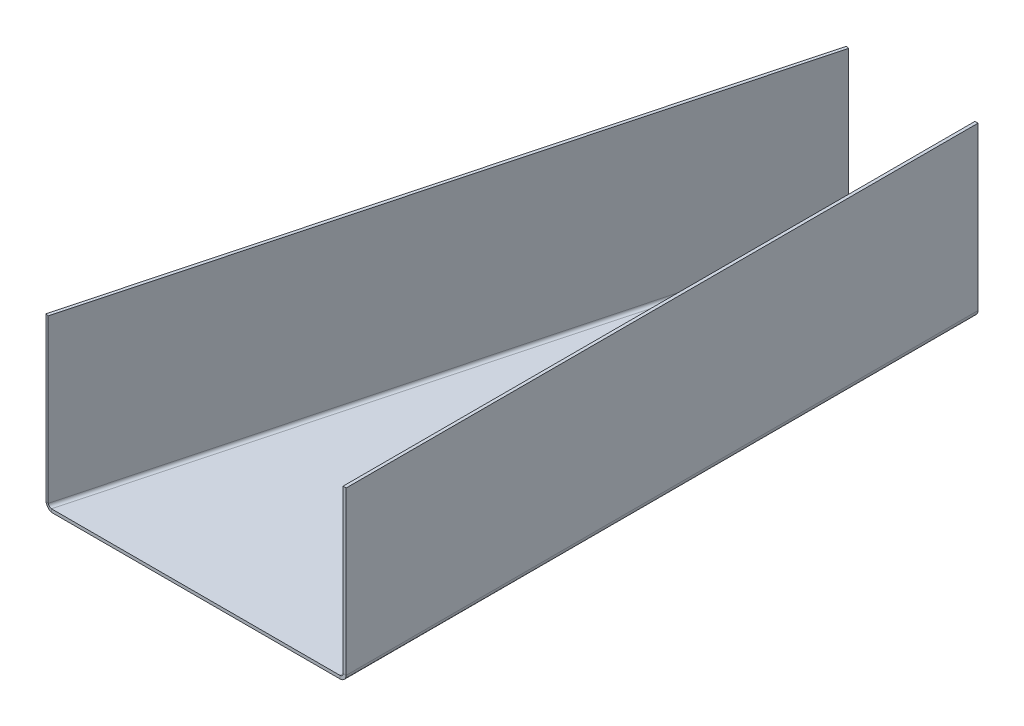
ISO-10303-21;
HEADER;
FILE_DESCRIPTION(('STEP AP214'),'2;1');
FILE_NAME('part.step','',(''),(''),'','','');
FILE_SCHEMA(('AUTOMOTIVE_DESIGN { 1 0 10303 214 1 1 1 1 }'));
ENDSEC;
DATA;
#1=APPLICATION_CONTEXT('core data for automotive mechanical design processes');
#2=APPLICATION_PROTOCOL_DEFINITION('international standard','automotive_design',2000,#1);
#3=PRODUCT_CONTEXT('',#1,'mechanical');
#4=PRODUCT('Part','Part','',(#3));
#5=PRODUCT_RELATED_PRODUCT_CATEGORY('part','',(#4));
#6=PRODUCT_DEFINITION_FORMATION('','',#4);
#7=PRODUCT_DEFINITION_CONTEXT('part definition',#1,'design');
#8=PRODUCT_DEFINITION('design','',#6,#7);
#9=PRODUCT_DEFINITION_SHAPE('','',#8);
#10=(LENGTH_UNIT() NAMED_UNIT(*) SI_UNIT(.MILLI.,.METRE.));
#11=(NAMED_UNIT(*) PLANE_ANGLE_UNIT() SI_UNIT($,.RADIAN.));
#12=(NAMED_UNIT(*) SI_UNIT($,.STERADIAN.) SOLID_ANGLE_UNIT());
#13=UNCERTAINTY_MEASURE_WITH_UNIT(LENGTH_MEASURE(1.E-05),#10,'distance_accuracy_value','');
#14=(GEOMETRIC_REPRESENTATION_CONTEXT(3) GLOBAL_UNCERTAINTY_ASSIGNED_CONTEXT((#13)) GLOBAL_UNIT_ASSIGNED_CONTEXT((#10,
#11,#12)) REPRESENTATION_CONTEXT('',''));
#15=CARTESIAN_POINT('',(0.,0.,0.));
#16=DIRECTION('',(0.,0.,1.));
#17=DIRECTION('',(1.,0.,0.));
#18=AXIS2_PLACEMENT_3D('',#15,#16,#17);
#19=CARTESIAN_POINT('',(5.22681161664081,-0.7366,-75.4860248928017));
#20=DIRECTION('',(0.,0.,-1.));
#21=DIRECTION('',(-1.,0.,0.));
#22=AXIS2_PLACEMENT_3D('',#19,#20,#21);
#23=PLANE('',#22);
#24=DIRECTION('',(-1.,0.,0.));
#25=VECTOR('',#24,1.);
#26=CARTESIAN_POINT('',(5.22681161664081,-0.7366,-75.4860248928017));
#27=LINE('',#26,#25);
#28=CARTESIAN_POINT('',(34.4902116166408,-0.736599999999994,-75.4860248928017));
#29=VERTEX_POINT('',#28);
#30=CARTESIAN_POINT('',(6.37032232476729,-0.7366,-75.4860248928017));
#31=VERTEX_POINT('',#30);
#32=EDGE_CURVE('E45',#29,#31,#27,.T.);
#33=ORIENTED_EDGE('',*,*,#32,.T.);
#34=DIRECTION('',(0.,1.,0.));
#35=VECTOR('',#34,1.);
#36=CARTESIAN_POINT('',(6.37032232476729,-0.7366,-75.4860248928017));
#37=LINE('',#36,#35);
#38=CARTESIAN_POINT('',(6.37032232476729,0.,-75.4860248928017));
#39=VERTEX_POINT('',#38);
#40=EDGE_CURVE('E183',#31,#39,#37,.T.);
#41=ORIENTED_EDGE('',*,*,#40,.T.);
#42=DIRECTION('',(-1.,0.,0.));
#43=VECTOR('',#42,1.);
#44=CARTESIAN_POINT('',(5.22681161664081,0.,-75.4860248928017));
#45=LINE('',#44,#43);
#46=CARTESIAN_POINT('',(34.4902116166408,0.,-75.4860248928017));
#47=VERTEX_POINT('',#46);
#48=EDGE_CURVE('E145',#47,#39,#45,.T.);
#49=ORIENTED_EDGE('',*,*,#48,.F.);
#50=DIRECTION('',(0.,-1.,0.));
#51=VECTOR('',#50,1.);
#52=CARTESIAN_POINT('',(34.4902116166408,0.,-75.4860248928017));
#53=LINE('',#52,#51);
#54=EDGE_CURVE('E102',#47,#29,#53,.T.);
#55=ORIENTED_EDGE('',*,*,#54,.T.);
#56=EDGE_LOOP('',(#33,#41,#49,#55));
#57=FACE_BOUND('',#56,.T.);
#58=ADVANCED_FACE('F37',(#57),#23,.T.);
#59=CARTESIAN_POINT('',(0.,-0.7366,0.));
#60=DIRECTION('',(0.,-1.,0.));
#61=DIRECTION('',(0.,0.,-1.));
#62=AXIS2_PLACEMENT_3D('',#59,#60,#61);
#63=PLANE('',#62);
#64=DIRECTION('',(1.,0.,0.));
#65=VECTOR('',#64,1.);
#66=CARTESIAN_POINT('',(-34.7731883833592,-0.7366,74.5139751071983));
#67=LINE('',#66,#65);
#68=CARTESIAN_POINT('',(-34.0108479112749,-0.736599999999982,74.5139751071983));
#69=VERTEX_POINT('',#68);
#70=CARTESIAN_POINT('',(34.4902116166408,-0.7366,74.5139751071983));
#71=VERTEX_POINT('',#70);
#72=EDGE_CURVE('E11',#69,#71,#67,.T.);
#73=ORIENTED_EDGE('',*,*,#72,.F.);
#74=DIRECTION('',(-0.257662650560332,0.,0.966234939601246));
#75=VECTOR('',#74,1.);
#76=CARTESIAN_POINT('',(-34.0614597268489,-0.736599999999982,74.703769415601));
#77=LINE('',#76,#75);
#78=CARTESIAN_POINT('',(5.93854027315106,-0.7366,-75.296230584399));
#79=VERTEX_POINT('',#78);
#80=EDGE_CURVE('E274',#69,#79,#77,.F.);
#81=ORIENTED_EDGE('',*,*,#80,.T.);
#82=DIRECTION('',(0.966234939601246,0.,0.257662650560332));
#83=VECTOR('',#82,1.);
#84=CARTESIAN_POINT('',(19.1402094582338,-0.7366,-71.7757854683769));
#85=LINE('',#84,#83);
#86=CARTESIAN_POINT('',(6.2944046014062,-0.7366,-75.2013334301976));
#87=VERTEX_POINT('',#86);
#88=EDGE_CURVE('E192',#79,#87,#85,.T.);
#89=ORIENTED_EDGE('',*,*,#88,.T.);
#90=DIRECTION('',(0.25766265056033,0.,-0.966234939601247));
#91=VECTOR('',#90,1.);
#92=CARTESIAN_POINT('',(-12.8458048568275,-0.7366,-3.42554796182063));
#93=LINE('',#92,#91);
#94=EDGE_CURVE('E188',#87,#31,#93,.T.);
#95=ORIENTED_EDGE('',*,*,#94,.T.);
#96=ORIENTED_EDGE('',*,*,#32,.F.);
#97=DIRECTION('',(0.,0.,-1.));
#98=VECTOR('',#97,1.);
#99=CARTESIAN_POINT('',(34.4902116166408,-0.736599999999994,-75.4860248928017));
#100=LINE('',#99,#98);
#101=EDGE_CURVE('E59',#29,#71,#100,.F.);
#102=ORIENTED_EDGE('',*,*,#101,.T.);
#103=EDGE_LOOP('',(#73,#81,#89,#95,#96,#102));
#104=FACE_BOUND('',#103,.T.);
#105=ADVANCED_FACE('F170',(#104),#63,.T.);
#106=CARTESIAN_POINT('',(0.,0.,0.));
#107=DIRECTION('',(0.,-1.,0.));
#108=DIRECTION('',(0.,0.,-1.));
#109=AXIS2_PLACEMENT_3D('',#106,#107,#108);
#110=PLANE('',#109);
#111=DIRECTION('',(-0.257662650560332,0.,0.966234939601246));
#112=VECTOR('',#111,1.);
#113=CARTESIAN_POINT('',(-34.0614597268489,0.,74.703769415601));
#114=LINE('',#113,#112);
#115=CARTESIAN_POINT('',(-34.0108479112749,0.,74.5139751071983));
#116=VERTEX_POINT('',#115);
#117=CARTESIAN_POINT('',(5.93854027315106,0.,-75.296230584399));
#118=VERTEX_POINT('',#117);
#119=EDGE_CURVE('E159',#116,#118,#114,.F.);
#120=ORIENTED_EDGE('',*,*,#119,.F.);
#121=DIRECTION('',(1.,0.,0.));
#122=VECTOR('',#121,1.);
#123=CARTESIAN_POINT('',(-34.7731883833592,0.,74.5139751071983));
#124=LINE('',#123,#122);
#125=CARTESIAN_POINT('',(34.4902116166408,0.,74.5139751071983));
#126=VERTEX_POINT('',#125);
#127=EDGE_CURVE('E40',#116,#126,#124,.T.);
#128=ORIENTED_EDGE('',*,*,#127,.T.);
#129=DIRECTION('',(0.,0.,-1.));
#130=VECTOR('',#129,1.);
#131=CARTESIAN_POINT('',(34.4902116166408,0.,-75.4860248928017));
#132=LINE('',#131,#130);
#133=EDGE_CURVE('E103',#47,#126,#132,.F.);
#134=ORIENTED_EDGE('',*,*,#133,.F.);
#135=ORIENTED_EDGE('',*,*,#48,.T.);
#136=DIRECTION('',(0.25766265056033,0.,-0.966234939601247));
#137=VECTOR('',#136,1.);
#138=CARTESIAN_POINT('',(6.2944046014062,0.,-75.2013334301976));
#139=LINE('',#138,#137);
#140=CARTESIAN_POINT('',(6.2944046014062,0.,-75.2013334301976));
#141=VERTEX_POINT('',#140);
#142=EDGE_CURVE('E200',#141,#39,#139,.T.);
#143=ORIENTED_EDGE('',*,*,#142,.F.);
#144=DIRECTION('',(0.966234939601246,0.,0.257662650560332));
#145=VECTOR('',#144,1.);
#146=CARTESIAN_POINT('',(5.93854027315106,0.,-75.296230584399));
#147=LINE('',#146,#145);
#148=EDGE_CURVE('E196',#118,#141,#147,.T.);
#149=ORIENTED_EDGE('',*,*,#148,.F.);
#150=EDGE_LOOP('',(#120,#128,#134,#135,#143,#149));
#151=FACE_BOUND('',#150,.T.);
#152=ADVANCED_FACE('F155',(#151),#110,.F.);
#153=CARTESIAN_POINT('',(-34.7731883833592,-0.7366,74.5139751071983));
#154=DIRECTION('',(0.,0.,1.));
#155=DIRECTION('',(1.,0.,0.));
#156=AXIS2_PLACEMENT_3D('',#153,#154,#155);
#157=PLANE('',#156);
#158=ORIENTED_EDGE('',*,*,#127,.F.);
#159=DIRECTION('',(0.,-1.,0.));
#160=VECTOR('',#159,1.);
#161=CARTESIAN_POINT('',(-34.0108479112749,0.,74.5139751071983));
#162=LINE('',#161,#160);
#163=EDGE_CURVE('E319',#116,#69,#162,.T.);
#164=ORIENTED_EDGE('',*,*,#163,.T.);
#165=ORIENTED_EDGE('',*,*,#72,.T.);
#166=DIRECTION('',(0.,-1.,0.));
#167=VECTOR('',#166,1.);
#168=CARTESIAN_POINT('',(34.4902116166408,0.,74.5139751071983));
#169=LINE('',#168,#167);
#170=EDGE_CURVE('E142',#126,#71,#169,.T.);
#171=ORIENTED_EDGE('',*,*,#170,.F.);
#172=EDGE_LOOP('',(#158,#164,#165,#171));
#173=FACE_BOUND('',#172,.T.);
#174=ADVANCED_FACE('F163',(#173),#157,.T.);
#175=CARTESIAN_POINT('',(34.4902116166408,0.736600000000003,74.5139751071983));
#176=DIRECTION('',(0.,0.,1.));
#177=DIRECTION('',(1.,0.,0.));
#178=AXIS2_PLACEMENT_3D('',#175,#176,#177);
#179=PLANE('',#178);
#180=DIRECTION('',(1.,0.,0.));
#181=VECTOR('',#180,1.);
#182=CARTESIAN_POINT('',(35.2268116166408,0.736599999999997,74.5139751071983));
#183=LINE('',#182,#181);
#184=CARTESIAN_POINT('',(35.2268116166408,0.7366,74.5139751071983));
#185=VERTEX_POINT('',#184);
#186=CARTESIAN_POINT('',(35.9634116166408,0.736599999999998,74.5139751071983));
#187=VERTEX_POINT('',#186);
#188=EDGE_CURVE('E93',#185,#187,#183,.T.);
#189=ORIENTED_EDGE('',*,*,#188,.F.);
#190=CARTESIAN_POINT('',(34.4902116166408,0.736600000000003,74.5139751071983));
#191=DIRECTION('',(0.,0.,-1.));
#192=DIRECTION('',(-1.,0.,0.));
#193=AXIS2_PLACEMENT_3D('',#190,#191,#192);
#194=CIRCLE('',#193,0.736599999999997);
#195=EDGE_CURVE('E87',#126,#185,#194,.F.);
#196=ORIENTED_EDGE('',*,*,#195,.F.);
#197=ORIENTED_EDGE('',*,*,#170,.T.);
#198=CARTESIAN_POINT('',(34.4902116166408,0.736600000000003,74.5139751071983));
#199=DIRECTION('',(0.,0.,-1.));
#200=DIRECTION('',(-1.,0.,0.));
#201=AXIS2_PLACEMENT_3D('',#198,#199,#200);
#202=CIRCLE('',#201,1.4732);
#203=EDGE_CURVE('E135',#71,#187,#202,.F.);
#204=ORIENTED_EDGE('',*,*,#203,.T.);
#205=EDGE_LOOP('',(#189,#196,#197,#204));
#206=FACE_BOUND('',#205,.T.);
#207=ADVANCED_FACE('F161',(#206),#179,.T.);
#208=CARTESIAN_POINT('',(34.4902116166408,0.736600000000003,-75.4860248928017));
#209=DIRECTION('',(0.,0.,1.));
#210=DIRECTION('',(1.,0.,0.));
#211=AXIS2_PLACEMENT_3D('',#208,#209,#210);
#212=PLANE('',#211);
#213=CARTESIAN_POINT('',(34.4902116166408,0.736600000000003,-75.4860248928017));
#214=DIRECTION('',(0.,0.,-1.));
#215=DIRECTION('',(-1.,0.,0.));
#216=AXIS2_PLACEMENT_3D('',#213,#214,#215);
#217=CIRCLE('',#216,0.736599999999997);
#218=CARTESIAN_POINT('',(35.2268116166408,0.7366,-75.4860248928017));
#219=VERTEX_POINT('',#218);
#220=EDGE_CURVE('E84',#219,#47,#217,.T.);
#221=ORIENTED_EDGE('',*,*,#220,.F.);
#222=DIRECTION('',(1.,0.,0.));
#223=VECTOR('',#222,1.);
#224=CARTESIAN_POINT('',(35.2268116166408,0.736600000000004,-75.4860248928017));
#225=LINE('',#224,#223);
#226=CARTESIAN_POINT('',(35.9634116166408,0.736600000000001,-75.4860248928017));
#227=VERTEX_POINT('',#226);
#228=EDGE_CURVE('E92',#219,#227,#225,.T.);
#229=ORIENTED_EDGE('',*,*,#228,.T.);
#230=CARTESIAN_POINT('',(34.4902116166408,0.736600000000003,-75.4860248928017));
#231=DIRECTION('',(0.,0.,-1.));
#232=DIRECTION('',(-1.,0.,0.));
#233=AXIS2_PLACEMENT_3D('',#230,#231,#232);
#234=CIRCLE('',#233,1.4732);
#235=EDGE_CURVE('E136',#227,#29,#234,.T.);
#236=ORIENTED_EDGE('',*,*,#235,.T.);
#237=ORIENTED_EDGE('',*,*,#54,.F.);
#238=EDGE_LOOP('',(#221,#229,#236,#237));
#239=FACE_BOUND('',#238,.T.);
#240=ADVANCED_FACE('F98',(#239),#212,.F.);
#241=CARTESIAN_POINT('',(34.4902116166408,0.736600000000003,-75.4860248928017));
#242=DIRECTION('',(0.,0.,-1.));
#243=DIRECTION('',(1.,0.,0.));
#244=AXIS2_PLACEMENT_3D('',#241,#242,#243);
#245=CYLINDRICAL_SURFACE('',#244,1.4732);
#246=ORIENTED_EDGE('',*,*,#101,.F.);
#247=ORIENTED_EDGE('',*,*,#235,.F.);
#248=DIRECTION('',(0.,0.,1.));
#249=VECTOR('',#248,1.);
#250=CARTESIAN_POINT('',(35.9634116166408,0.736599999999998,0.));
#251=LINE('',#250,#249);
#252=EDGE_CURVE('E116',#227,#187,#251,.T.);
#253=ORIENTED_EDGE('',*,*,#252,.T.);
#254=ORIENTED_EDGE('',*,*,#203,.F.);
#255=EDGE_LOOP('',(#246,#247,#253,#254));
#256=FACE_BOUND('',#255,.T.);
#257=ADVANCED_FACE('F370',(#256),#245,.T.);
#258=CARTESIAN_POINT('',(34.4902116166408,0.736600000000003,-75.4860248928017));
#259=DIRECTION('',(0.,0.,-1.));
#260=DIRECTION('',(1.,0.,0.));
#261=AXIS2_PLACEMENT_3D('',#258,#259,#260);
#262=CYLINDRICAL_SURFACE('',#261,0.736599999999997);
#263=ORIENTED_EDGE('',*,*,#133,.T.);
#264=ORIENTED_EDGE('',*,*,#195,.T.);
#265=DIRECTION('',(0.,0.,-1.));
#266=VECTOR('',#265,1.);
#267=CARTESIAN_POINT('',(35.2268116166408,0.736599999999997,74.5139751071983));
#268=LINE('',#267,#266);
#269=EDGE_CURVE('E80',#185,#219,#268,.T.);
#270=ORIENTED_EDGE('',*,*,#269,.T.);
#271=ORIENTED_EDGE('',*,*,#220,.T.);
#272=EDGE_LOOP('',(#263,#264,#270,#271));
#273=FACE_BOUND('',#272,.T.);
#274=ADVANCED_FACE('F83',(#273),#262,.F.);
#275=CARTESIAN_POINT('',(35.9634116166408,0.,74.5139751071983));
#276=DIRECTION('',(0.,0.,-1.));
#277=DIRECTION('',(-1.,0.,0.));
#278=AXIS2_PLACEMENT_3D('',#275,#276,#277);
#279=PLANE('',#278);
#280=ORIENTED_EDGE('',*,*,#188,.T.);
#281=DIRECTION('',(0.,-1.,0.));
#282=VECTOR('',#281,1.);
#283=CARTESIAN_POINT('',(35.9634116166408,0.,74.5139751071983));
#284=LINE('',#283,#282);
#285=CARTESIAN_POINT('',(35.9634116166409,39.2634,74.5139751071983));
#286=VERTEX_POINT('',#285);
#287=EDGE_CURVE('E124',#286,#187,#284,.T.);
#288=ORIENTED_EDGE('',*,*,#287,.F.);
#289=DIRECTION('',(-1.,0.,0.));
#290=VECTOR('',#289,1.);
#291=CARTESIAN_POINT('',(35.9634116166409,39.2634,74.5139751071983));
#292=LINE('',#291,#290);
#293=CARTESIAN_POINT('',(35.226811616641,39.2634,74.5139751071983));
#294=VERTEX_POINT('',#293);
#295=EDGE_CURVE('E129',#286,#294,#292,.T.);
#296=ORIENTED_EDGE('',*,*,#295,.T.);
#297=DIRECTION('',(0.,-1.,0.));
#298=VECTOR('',#297,1.);
#299=CARTESIAN_POINT('',(35.2268116166408,0.,74.5139751071983));
#300=LINE('',#299,#298);
#301=EDGE_CURVE('E122',#294,#185,#300,.T.);
#302=ORIENTED_EDGE('',*,*,#301,.T.);
#303=EDGE_LOOP('',(#280,#288,#296,#302));
#304=FACE_BOUND('',#303,.T.);
#305=ADVANCED_FACE('F223',(#304),#279,.F.);
#306=CARTESIAN_POINT('',(35.9634116166409,39.2634,-75.4860248928017));
#307=DIRECTION('',(0.,0.,1.));
#308=DIRECTION('',(1.,0.,0.));
#309=AXIS2_PLACEMENT_3D('',#306,#307,#308);
#310=PLANE('',#309);
#311=ORIENTED_EDGE('',*,*,#228,.F.);
#312=DIRECTION('',(0.,1.,0.));
#313=VECTOR('',#312,1.);
#314=CARTESIAN_POINT('',(35.226811616641,39.2634,-75.4860248928017));
#315=LINE('',#314,#313);
#316=CARTESIAN_POINT('',(35.226811616641,39.2634,-75.4860248928017));
#317=VERTEX_POINT('',#316);
#318=EDGE_CURVE('E112',#219,#317,#315,.T.);
#319=ORIENTED_EDGE('',*,*,#318,.T.);
#320=DIRECTION('',(-1.,0.,0.));
#321=VECTOR('',#320,1.);
#322=CARTESIAN_POINT('',(35.9634116166409,39.2634,-75.4860248928017));
#323=LINE('',#322,#321);
#324=CARTESIAN_POINT('',(35.9634116166409,39.2634,-75.4860248928017));
#325=VERTEX_POINT('',#324);
#326=EDGE_CURVE('E104',#325,#317,#323,.T.);
#327=ORIENTED_EDGE('',*,*,#326,.F.);
#328=DIRECTION('',(0.,1.,0.));
#329=VECTOR('',#328,1.);
#330=CARTESIAN_POINT('',(35.9634116166409,39.2634,-75.4860248928017));
#331=LINE('',#330,#329);
#332=EDGE_CURVE('E115',#227,#325,#331,.T.);
#333=ORIENTED_EDGE('',*,*,#332,.F.);
#334=EDGE_LOOP('',(#311,#319,#327,#333));
#335=FACE_BOUND('',#334,.T.);
#336=ADVANCED_FACE('F109',(#335),#310,.F.);
#337=CARTESIAN_POINT('',(35.9634116166408,-1.27082238608349E-13,0.));
#338=DIRECTION('',(-1.,0.,0.));
#339=DIRECTION('',(0.,-1.,0.));
#340=AXIS2_PLACEMENT_3D('',#337,#338,#339);
#341=PLANE('',#340);
#342=ORIENTED_EDGE('',*,*,#252,.F.);
#343=ORIENTED_EDGE('',*,*,#332,.T.);
#344=DIRECTION('',(0.,0.,1.));
#345=VECTOR('',#344,1.);
#346=CARTESIAN_POINT('',(35.9634116166409,39.2634,74.5139751071983));
#347=LINE('',#346,#345);
#348=EDGE_CURVE('E132',#325,#286,#347,.T.);
#349=ORIENTED_EDGE('',*,*,#348,.T.);
#350=ORIENTED_EDGE('',*,*,#287,.T.);
#351=EDGE_LOOP('',(#342,#343,#349,#350));
#352=FACE_BOUND('',#351,.T.);
#353=ADVANCED_FACE('F215',(#352),#341,.F.);
#354=CARTESIAN_POINT('',(35.2268116166408,-1.24510413454157E-13,0.));
#355=DIRECTION('',(-1.,0.,0.));
#356=DIRECTION('',(0.,-1.,0.));
#357=AXIS2_PLACEMENT_3D('',#354,#355,#356);
#358=PLANE('',#357);
#359=ORIENTED_EDGE('',*,*,#318,.F.);
#360=ORIENTED_EDGE('',*,*,#269,.F.);
#361=ORIENTED_EDGE('',*,*,#301,.F.);
#362=DIRECTION('',(0.,0.,1.));
#363=VECTOR('',#362,1.);
#364=CARTESIAN_POINT('',(35.226811616641,39.2634,74.5139751071983));
#365=LINE('',#364,#363);
#366=EDGE_CURVE('E121',#317,#294,#365,.T.);
#367=ORIENTED_EDGE('',*,*,#366,.F.);
#368=EDGE_LOOP('',(#359,#360,#361,#367));
#369=FACE_BOUND('',#368,.T.);
#370=ADVANCED_FACE('F119',(#369),#358,.T.);
#371=CARTESIAN_POINT('',(35.9634116166409,39.2634,74.5139751071983));
#372=DIRECTION('',(0.,-1.,0.));
#373=DIRECTION('',(1.,0.,0.));
#374=AXIS2_PLACEMENT_3D('',#371,#372,#373);
#375=PLANE('',#374);
#376=ORIENTED_EDGE('',*,*,#366,.T.);
#377=ORIENTED_EDGE('',*,*,#295,.F.);
#378=ORIENTED_EDGE('',*,*,#348,.F.);
#379=ORIENTED_EDGE('',*,*,#326,.T.);
#380=EDGE_LOOP('',(#376,#377,#378,#379));
#381=FACE_BOUND('',#380,.T.);
#382=ADVANCED_FACE('F220',(#381),#375,.F.);
#383=CARTESIAN_POINT('',(5.93854027315106,0.,-75.296230584399));
#384=DIRECTION('',(0.257662650560332,0.,-0.966234939601246));
#385=DIRECTION('',(-0.966234939601246,0.,-0.257662650560332));
#386=AXIS2_PLACEMENT_3D('',#383,#384,#385);
#387=PLANE('',#386);
#388=ORIENTED_EDGE('',*,*,#88,.F.);
#389=DIRECTION('',(0.,-1.,0.));
#390=VECTOR('',#389,1.);
#391=CARTESIAN_POINT('',(5.93854027315106,0.,-75.296230584399));
#392=LINE('',#391,#390);
#393=EDGE_CURVE('E592',#118,#79,#392,.T.);
#394=ORIENTED_EDGE('',*,*,#393,.F.);
#395=ORIENTED_EDGE('',*,*,#148,.T.);
#396=DIRECTION('',(0.,-1.,0.));
#397=VECTOR('',#396,1.);
#398=CARTESIAN_POINT('',(6.2944046014062,0.,-75.2013334301976));
#399=LINE('',#398,#397);
#400=EDGE_CURVE('E203',#141,#87,#399,.T.);
#401=ORIENTED_EDGE('',*,*,#400,.T.);
#402=EDGE_LOOP('',(#388,#394,#395,#401));
#403=FACE_BOUND('',#402,.T.);
#404=ADVANCED_FACE('F356',(#403),#387,.T.);
#405=CARTESIAN_POINT('',(6.2944046014062,0.,-75.2013334301976));
#406=DIRECTION('',(-0.966234939601247,0.,-0.25766265056033));
#407=DIRECTION('',(-0.25766265056033,0.,0.966234939601247));
#408=AXIS2_PLACEMENT_3D('',#405,#406,#407);
#409=PLANE('',#408);
#410=ORIENTED_EDGE('',*,*,#40,.F.);
#411=ORIENTED_EDGE('',*,*,#94,.F.);
#412=ORIENTED_EDGE('',*,*,#400,.F.);
#413=ORIENTED_EDGE('',*,*,#142,.T.);
#414=EDGE_LOOP('',(#410,#411,#412,#413));
#415=FACE_BOUND('',#414,.T.);
#416=ADVANCED_FACE('F343',(#415),#409,.T.);
#417=CARTESIAN_POINT('',(5.93854027315107,0.736600000000001,-75.296230584399));
#418=DIRECTION('',(0.257662650560332,0.,-0.966234939601246));
#419=DIRECTION('',(-0.966234939601246,0.,-0.257662650560332));
#420=AXIS2_PLACEMENT_3D('',#417,#418,#419);
#421=PLANE('',#420);
#422=DIRECTION('',(-0.966234939601246,0.,-0.257662650560333));
#423=VECTOR('',#422,1.);
#424=CARTESIAN_POINT('',(5.22681161664081,0.736599999999999,-75.4860248928017));
#425=LINE('',#424,#423);
#426=CARTESIAN_POINT('',(5.22681161664081,0.736599999999999,-75.4860248928018));
#427=VERTEX_POINT('',#426);
#428=CARTESIAN_POINT('',(4.51508296013056,0.736599999999996,-75.6758192012046));
#429=VERTEX_POINT('',#428);
#430=EDGE_CURVE('E584',#427,#429,#425,.T.);
#431=ORIENTED_EDGE('',*,*,#430,.F.);
#432=CARTESIAN_POINT('',(5.93854027315107,0.736600000000001,-75.296230584399));
#433=DIRECTION('',(-0.257662650560332,0.,0.966234939601246));
#434=DIRECTION('',(0.966234939601246,0.,0.257662650560332));
#435=AXIS2_PLACEMENT_3D('',#432,#433,#434);
#436=CIRCLE('',#435,0.736599999999983);
#437=EDGE_CURVE('E276',#118,#427,#436,.F.);
#438=ORIENTED_EDGE('',*,*,#437,.F.);
#439=ORIENTED_EDGE('',*,*,#393,.T.);
#440=CARTESIAN_POINT('',(5.93854027315108,0.736600000000001,-75.296230584399));
#441=DIRECTION('',(-0.257662650560332,0.,0.966234939601246));
#442=DIRECTION('',(0.966234939601246,0.,0.257662650560332));
#443=AXIS2_PLACEMENT_3D('',#440,#441,#442);
#444=CIRCLE('',#443,1.47319999999998);
#445=EDGE_CURVE('E317',#79,#429,#444,.F.);
#446=ORIENTED_EDGE('',*,*,#445,.T.);
#447=EDGE_LOOP('',(#431,#438,#439,#446));
#448=FACE_BOUND('',#447,.T.);
#449=ADVANCED_FACE('F340',(#448),#421,.T.);
#450=CARTESIAN_POINT('',(-35.4920343264346,0.736599999999996,74.3222828557115));
#451=CARTESIAN_POINT('',(-35.4878159199868,0.542759667509925,74.3064638315324));
#452=CARTESIAN_POINT('',(-35.4463649961854,0.349064981845723,74.3005795450186));
#453=CARTESIAN_POINT('',(-35.2946057343009,-0.00904113929180752,74.3071668827619));
#454=CARTESIAN_POINT('',(-35.1843545432254,-0.173276979006366,74.3196263010023));
#455=CARTESIAN_POINT('',(-34.9110910956188,-0.447359538182086,74.3586147549381));
#456=CARTESIAN_POINT('',(-34.748183037654,-0.557098417860092,74.3851160043491));
#457=CARTESIAN_POINT('',(-34.3937330887302,-0.705430830004081,74.4457541919695));
#458=CARTESIAN_POINT('',(-34.2023616196785,-0.743965999999979,74.4798487175224));
#459=CARTESIAN_POINT('',(-34.0108479112749,-0.743965999999982,74.5139751071983));
#460=CARTESIAN_POINT('',(-35.4849170398695,0.736599999999996,74.3241807987955));
#461=CARTESIAN_POINT('',(-35.4806986335803,0.543724050881794,74.3083617752113));
#462=CARTESIAN_POINT('',(-35.4394329535389,0.350993016761914,74.3024280897244));
#463=CARTESIAN_POINT('',(-35.2883867461782,-0.0053314818823955,74.3088252795946));
#464=CARTESIAN_POINT('',(-35.1786630851515,-0.168750227867031,74.3211440231554));
#465=CARTESIAN_POINT('',(-34.9067171905051,-0.441469192220981,74.3597811296351));
#466=CARTESIAN_POINT('',(-34.7445986370511,-0.550662107323475,74.3860718445099));
#467=CARTESIAN_POINT('',(-34.3918701540294,-0.698256547267743,74.4462509745564));
#468=CARTESIAN_POINT('',(-34.2014297986108,-0.736599999999979,74.4800972025034));
#469=CARTESIAN_POINT('',(-34.0108479112749,-0.736599999999982,74.5139751071983));
#470=CARTESIAN_POINT('',(-34.7731883833592,0.736599999999999,74.5139751071982));
#471=CARTESIAN_POINT('',(-34.7689699929322,0.64016238806869,74.498156143097));
#472=CARTESIAN_POINT('',(-34.7462286888961,0.543796508380959,74.4872825602958));
#473=CARTESIAN_POINT('',(-34.6664879339179,0.365634259058806,74.474664962864));
#474=CARTESIAN_POINT('',(-34.6095172777556,0.283924886066491,74.472916238461));
#475=CARTESIAN_POINT('',(-34.4693266791346,0.147565403889518,74.4764185993339));
#476=CARTESIAN_POINT('',(-34.3861585767587,0.0929689463382723,74.4816558605879));
#477=CARTESIAN_POINT('',(-34.20557668395,0.0191717263661385,74.4959292332442));
#478=CARTESIAN_POINT('',(-34.1082476918416,0.,74.5049457005956));
#479=CARTESIAN_POINT('',(-34.0108479112749,0.,74.5139751071983));
#480=CARTESIAN_POINT('',(-34.7659999239284,0.736599999999999,74.5158920297131));
#481=CARTESIAN_POINT('',(-34.7617815336616,0.641136415274278,74.5000730662127));
#482=CARTESIAN_POINT('',(-34.7392273258232,0.545743823646312,74.4891495904485));
#483=CARTESIAN_POINT('',(-34.6602067559141,0.369381013042313,74.476339943665));
#484=CARTESIAN_POINT('',(-34.6037689051009,0.28849690471722,74.4744491378355));
#485=CARTESIAN_POINT('',(-34.4649090349697,0.153514653310234,74.4775966377779));
#486=CARTESIAN_POINT('',(-34.3825383321497,0.0994696199802559,74.4826212591503));
#487=CARTESIAN_POINT('',(-34.2036951199022,0.0264177519298407,74.496430983657));
#488=CARTESIAN_POINT('',(-34.1073065525632,0.00743966000001948,74.5051966704263));
#489=CARTESIAN_POINT('',(-34.0108479112749,0.00743966000001843,74.5139751071983));
#490=B_SPLINE_SURFACE_WITH_KNOTS('',1,3,((#450,#451,#452,#453,#454,#455,#456,#457,#458,#459),
(#460,#461,#462,#463,#464,#465,#466,#467,#468,#469),(#470,#471,#472,#473,#474,#475,#476,#477,
#478,#479),(#480,#481,#482,#483,#484,#485,#486,#487,#488,#489)),.UNSPECIFIED.,.F.,.F.,.F.,(2,1,
1,2),(4,2,2,2,4),(-0.01,0.,1.,1.0101),(0.,0.25,0.5,0.75,1.),.UNSPECIFIED.);
#491=CARTESIAN_POINT('',(-34.7731883833592,0.736599999999999,74.5139751071982));
#492=CARTESIAN_POINT('',(-34.77266142398,0.724547398513027,74.5119980172769));
#493=CARTESIAN_POINT('',(-34.7718481524947,0.712494818780692,74.5100972772505));
#494=CARTESIAN_POINT('',(-34.7696507590766,0.688418683400155,74.5064480239838));
#495=CARTESIAN_POINT('',(-34.7682666371438,0.676395127751953,74.5046995107434));
#496=CARTESIAN_POINT('',(-34.7649293165951,0.652406021114541,74.5013542380448));
#497=CARTESIAN_POINT('',(-34.7629761179792,0.640440470125331,74.4997574785866));
#498=CARTESIAN_POINT('',(-34.7585041572759,0.616596194907034,74.4967147765959));
#499=CARTESIAN_POINT('',(-34.7559853951885,0.604717470677948,74.4952688340634));
#500=CARTESIAN_POINT('',(-34.7503870845086,0.581075466927899,74.4925264920665));
#501=CARTESIAN_POINT('',(-34.7473075359162,0.569312187406937,74.491230092602));
#502=CARTESIAN_POINT('',(-34.740593806633,0.545929411559584,74.4887851955659));
#503=CARTESIAN_POINT('',(-34.7369596259423,0.534309915233192,74.4876366979943));
#504=CARTESIAN_POINT('',(-34.7291441159376,0.511242698235545,74.4854856091507));
#505=CARTESIAN_POINT('',(-34.7249627866237,0.499794977564289,74.4844830178786));
#506=CARTESIAN_POINT('',(-34.7160617828763,0.477098890418305,74.482621394033));
#507=CARTESIAN_POINT('',(-34.7113421084428,0.465850523943576,74.4817623614595));
#508=CARTESIAN_POINT('',(-34.7013745143712,0.44358024349619,74.4801851617003));
#509=CARTESIAN_POINT('',(-34.6961265947332,0.432558329523533,74.4794669945147));
#510=CARTESIAN_POINT('',(-34.6851138828931,0.410767506834993,74.4781684928271));
#511=CARTESIAN_POINT('',(-34.679349090691,0.39999859811911,74.4775881583252));
#512=CARTESIAN_POINT('',(-34.667315251518,0.378739729188851,74.4765619572597));
#513=CARTESIAN_POINT('',(-34.6610462045471,0.368249768974475,74.4761160906962));
#514=CARTESIAN_POINT('',(-34.6480176884354,0.347574068280093,74.4753551368144));
#515=CARTESIAN_POINT('',(-34.6412582192945,0.337388327800088,74.4750400494962));
#516=CARTESIAN_POINT('',(-34.6272638729092,0.317345604915458,74.4745366503541));
#517=CARTESIAN_POINT('',(-34.6200289956646,0.307488622510834,74.4743483385301));
#518=CARTESIAN_POINT('',(-34.6050999924386,0.28812716211094,74.4740941812122));
#519=CARTESIAN_POINT('',(-34.5974058664571,0.278622684115671,74.4740283357181));
#520=CARTESIAN_POINT('',(-34.581575631494,0.259989129654475,74.4740145068634));
#521=CARTESIAN_POINT('',(-34.5734395225124,0.250860053188547,74.4740665235026));
#522=CARTESIAN_POINT('',(-34.556743652062,0.232999294530854,74.4742835307779));
#523=CARTESIAN_POINT('',(-34.5481838905932,0.224267612339088,74.4744485214137));
#524=CARTESIAN_POINT('',(-34.530660066297,0.207222677616921,74.4748863163812));
#525=CARTESIAN_POINT('',(-34.5216960034696,0.198909425086521,74.4751591207127));
#526=CARTESIAN_POINT('',(-34.5033839015823,0.182721377040585,74.4758071230377));
#527=CARTESIAN_POINT('',(-34.4940358625224,0.174846581525049,74.4761823210312));
#528=CARTESIAN_POINT('',(-34.4749770583285,0.159554418581,74.4770294439713));
#529=CARTESIAN_POINT('',(-34.4652662931946,0.152137051152487,74.4775013689179));
#530=CARTESIAN_POINT('',(-34.44550416085,0.137777613470262,74.4785360460316));
#531=CARTESIAN_POINT('',(-34.4354527936394,0.13083554321655,74.4790987981986));
#532=CARTESIAN_POINT('',(-34.4150324016791,0.117443423939376,74.4803090112098));
#533=CARTESIAN_POINT('',(-34.4046633769294,0.110993374915915,74.4809564720539));
#534=CARTESIAN_POINT('',(-34.3836313796933,0.0986008368317218,74.4823297798053));
#535=CARTESIAN_POINT('',(-34.3729684072069,0.0926583477709904,74.4830556267126));
#536=CARTESIAN_POINT('',(-34.3513729324456,0.0812952455910496,74.4845791951373));
#537=CARTESIAN_POINT('',(-34.3404404301707,0.0758746324718402,74.4853769166548));
#538=CARTESIAN_POINT('',(-34.3183309631019,0.0655683408987422,74.4870375496949));
#539=CARTESIAN_POINT('',(-34.307153998308,0.0606826624448534,74.4879004612175));
#540=CARTESIAN_POINT('',(-34.2845812624006,0.0514580102595565,74.4896846326146));
#541=CARTESIAN_POINT('',(-34.2731854912871,0.0471190365281486,74.4906058924891));
#542=CARTESIAN_POINT('',(-34.2502013260699,0.038998246644264,74.4924997783688));
#543=CARTESIAN_POINT('',(-34.2386129319663,0.0352164304917875,74.4934724043739));
#544=CARTESIAN_POINT('',(-34.2152701681194,0.028219066907562,74.4954619165549));
#545=CARTESIAN_POINT('',(-34.203515798376,0.025003519475813,74.4964788027306));
#546=CARTESIAN_POINT('',(-34.179868130543,0.0191464383180235,74.4985496226412));
#547=CARTESIAN_POINT('',(-34.1679748324533,0.0165049045919831,74.499603556376));
#548=CARTESIAN_POINT('',(-34.1440766895633,0.0118022203180168,74.5017411696351));
#549=CARTESIAN_POINT('',(-34.1320718447631,0.0097410697700909,74.5028248491593));
#550=CARTESIAN_POINT('',(-34.1079782601132,0.00620409574983276,74.5050145802211));
#551=CARTESIAN_POINT('',(-34.0958895202637,0.0047282722775004,74.5061206317585));
#552=CARTESIAN_POINT('',(-34.0716559944363,0.00236558838905713,74.5083476804675));
#553=CARTESIAN_POINT('',(-34.0595112084586,0.00147872797294629,74.5094686776391));
#554=CARTESIAN_POINT('',(-34.0351935924188,0.000295805945631161,74.5117181504048));
#555=CARTESIAN_POINT('',(-34.0230207623569,-2.5566557308834E-07,74.5128466259989));
#556=CARTESIAN_POINT('',(-34.0108479112749,0.,74.5139751071983));
#557=B_SPLINE_CURVE_WITH_KNOTS('',3,(#491,#492,#493,#494,#495,#496,#497,#498,#499,#500,#501,
#502,#503,#504,#505,#506,#507,#508,#509,#510,#511,#512,#513,#514,#515,#516,#517,#518,#519,#520,
#521,#522,#523,#524,#525,#526,#527,#528,#529,#530,#531,#532,#533,#534,#535,#536,#537,#538,#539,
#540,#541,#542,#543,#544,#545,#546,#547,#548,#549,#550,#551,#552,#553,#554,#555,#556),
.UNSPECIFIED.,.F.,.F.,(4,2,2,2,2,2,2,2,2,2,2,2,2,2,2,2,2,2,2,2,2,2,2,2,2,2,2,2,2,2,2,2,4),(0.,
0.0366715260182554,0.0733430520365108,0.110014578054766,0.146686104073022,0.183357630091277,
0.220029156109533,0.256700682127788,0.293372208146045,0.330043734164299,0.366715260182555,
0.403386786200809,0.440058312219065,0.476729838237322,0.513401364255577,0.55007289027383,
0.586744416292085,0.623415942310341,0.660087468328596,0.696758994346852,0.733430520365108,
0.770102046383366,0.80677357240162,0.843445098419878,0.880116624438128,0.916788150456387,
0.953459676474645,0.990131202492897,1.02680272851115,1.06347425452941,1.10014578054766,
1.13681730656592,1.17348883258418),.UNSPECIFIED.);
#558=CARTESIAN_POINT('',(-34.7731883833592,0.736599999999999,74.5139751071983));
#559=VERTEX_POINT('',#558);
#560=EDGE_CURVE('E283',#559,#116,#557,.T.);
#561=DIRECTION('',(-0.966234939601246,0.,-0.257662650560333));
#562=VECTOR('',#561,1.);
#563=CARTESIAN_POINT('',(-34.7731883833592,0.736599999999999,74.5139751071982));
#564=LINE('',#563,#562);
#565=CARTESIAN_POINT('',(-35.4849170398695,0.736599999999996,74.3241807987955));
#566=VERTEX_POINT('',#565);
#567=EDGE_CURVE('E280',#559,#566,#564,.T.);
#568=CARTESIAN_POINT('',(-35.4849170398695,0.736599999999996,74.3241807987955));
#569=CARTESIAN_POINT('',(-35.4843903275233,0.712494797026053,74.3222036429987));
#570=CARTESIAN_POINT('',(-35.483290990965,0.688389637561383,74.3203791869918));
#571=CARTESIAN_POINT('',(-35.4799506169533,0.640237366800308,74.31703472855));
#572=CARTESIAN_POINT('',(-35.4777095794999,0.616190255503903,74.3155147261151));
#573=CARTESIAN_POINT('',(-35.4720893512269,0.568212042229078,74.3127782288096));
#574=CARTESIAN_POINT('',(-35.4687101604074,0.544280940250659,74.3115617339391));
#575=CARTESIAN_POINT('',(-35.4608206518253,0.496592389814065,74.3094303780494));
#576=CARTESIAN_POINT('',(-35.4563103340627,0.472834941355891,74.3085155170303));
#577=CARTESIAN_POINT('',(-35.4461681255274,0.425550933855793,74.3069848811281));
#578=CARTESIAN_POINT('',(-35.4405362347547,0.402024374813869,74.3063691062451));
#579=CARTESIAN_POINT('',(-35.4281631890127,0.355258823119162,74.3054333602647));
#580=CARTESIAN_POINT('',(-35.4214220340435,0.332019830466378,74.3051133891673));
#581=CARTESIAN_POINT('',(-35.4068454268587,0.285885396471084,74.3047652595717));
#582=CARTESIAN_POINT('',(-35.3990099746431,0.262989955128572,74.3047371010734));
#583=CARTESIAN_POINT('',(-35.3822623799727,0.217597780836603,74.3049679014739));
#584=CARTESIAN_POINT('',(-35.3733502375179,0.195101047887144,74.3052268603728));
#585=CARTESIAN_POINT('',(-35.3544694621992,0.150560486992372,74.3060265089462));
#586=CARTESIAN_POINT('',(-35.3445008293354,0.128516659047058,74.3065671986207));
#587=CARTESIAN_POINT('',(-35.3235298184797,0.0849350136699773,74.3079242433374));
#588=CARTESIAN_POINT('',(-35.3125274404878,0.0633971962382111,74.3087405983794));
#589=CARTESIAN_POINT('',(-35.2895141749663,0.0208794583776918,74.3106422443402));
#590=CARTESIAN_POINT('',(-35.2775032874367,-0.000100462051061412,74.311727535259));
#591=CARTESIAN_POINT('',(-35.2525006680377,-0.0414518634398246,74.3141596755872));
#592=CARTESIAN_POINT('',(-35.2395089361682,-0.0618233443998345,74.3155065249966));
#593=CARTESIAN_POINT('',(-35.2125746562219,-0.101908790169094,74.318453774804));
#594=CARTESIAN_POINT('',(-35.1986321081451,-0.121622754978344,74.320054175202));
#595=CARTESIAN_POINT('',(-35.1698285145174,-0.160345675778133,74.3234999086578));
#596=CARTESIAN_POINT('',(-35.1549674689666,-0.179354631768672,74.3253452417156));
#597=CARTESIAN_POINT('',(-35.1243614118649,-0.216621740691064,74.3292716320978));
#598=CARTESIAN_POINT('',(-35.108616400314,-0.234879893622917,74.3313526894222));
#599=CARTESIAN_POINT('',(-35.0762790722377,-0.270601410938304,74.3357407520643));
#600=CARTESIAN_POINT('',(-35.0596867557123,-0.288064775321838,74.338047757382));
#601=CARTESIAN_POINT('',(-35.0256935199443,-0.322154644766172,74.3428773954085));
#602=CARTESIAN_POINT('',(-35.0082926007017,-0.338781149826972,74.3454000281174));
#603=CARTESIAN_POINT('',(-34.9727228097515,-0.371157245918844,74.3506500808592));
#604=CARTESIAN_POINT('',(-34.954553938044,-0.386906836949916,74.3533775008921));
#605=CARTESIAN_POINT('',(-34.9174907424808,-0.417491162838014,74.3590257948641));
#606=CARTESIAN_POINT('',(-34.8985964186251,-0.432325897695041,74.3619466688031));
#607=CARTESIAN_POINT('',(-34.8601265667605,-0.461044773059492,74.3679700711221));
#608=CARTESIAN_POINT('',(-34.8405510387515,-0.474928913566916,74.3710725995021));
#609=CARTESIAN_POINT('',(-34.8007646676553,-0.501713152121264,74.3774470736161));
#610=CARTESIAN_POINT('',(-34.7805538245681,-0.514613250168187,74.3807190193503));
#611=CARTESIAN_POINT('',(-34.7395442429203,-0.539398326336572,74.3874196829448));
#612=CARTESIAN_POINT('',(-34.7187455043598,-0.551283304458035,74.3908484008051));
#613=CARTESIAN_POINT('',(-34.6766089676617,-0.574009508817918,74.3978495857464));
#614=CARTESIAN_POINT('',(-34.6552711695241,-0.584850735056338,74.4014220528273));
#615=CARTESIAN_POINT('',(-34.612106648211,-0.605463318202534,74.4086973669992));
#616=CARTESIAN_POINT('',(-34.5902799250355,-0.61523467511031,74.4124002140902));
#617=CARTESIAN_POINT('',(-34.5461888660451,-0.633683979480902,74.4199226049761));
#618=CARTESIAN_POINT('',(-34.5239245302302,-0.64236192694372,74.4237421487709));
#619=CARTESIAN_POINT('',(-34.4790106126204,-0.65860350671149,74.431483968622));
#620=CARTESIAN_POINT('',(-34.4563610308254,-0.666167139016444,74.4354062446781));
#621=CARTESIAN_POINT('',(-34.410729915956,-0.680161866184895,74.4433393171318));
#622=CARTESIAN_POINT('',(-34.3877483828815,-0.686592961048392,74.4473501135292));
#623=CARTESIAN_POINT('',(-34.3415074600399,-0.69830712336397,74.455445801442));
#624=CARTESIAN_POINT('',(-34.3182480702727,-0.703590190816052,74.4595306929575));
#625=CARTESIAN_POINT('',(-34.2715061973173,-0.712995559363986,74.4677599675673));
#626=CARTESIAN_POINT('',(-34.248023714129,-0.717117860459837,74.4719043506618));
#627=CARTESIAN_POINT('',(-34.2008909576538,-0.724191808500353,74.4802378608769));
#628=CARTESIAN_POINT('',(-34.1772406843668,-0.727143455445018,74.4844269879976));
#629=CARTESIAN_POINT('',(-34.1298280455366,-0.731868823221904,74.4928351335075));
#630=CARTESIAN_POINT('',(-34.1060656799933,-0.733642544054126,74.4970541518965));
#631=CARTESIAN_POINT('',(-34.0584848607384,-0.736008388108756,74.5055071455196));
#632=CARTESIAN_POINT('',(-34.0346664070267,-0.736600511331165,74.5097411207536));
#633=CARTESIAN_POINT('',(-34.0108479112749,-0.736599999999982,74.5139751071983));
#634=B_SPLINE_CURVE_WITH_KNOTS('',3,(#568,#569,#570,#571,#572,#573,#574,#575,#576,#577,#578,
#579,#580,#581,#582,#583,#584,#585,#586,#587,#588,#589,#590,#591,#592,#593,#594,#595,#596,#597,
#598,#599,#600,#601,#602,#603,#604,#605,#606,#607,#608,#609,#610,#611,#612,#613,#614,#615,#616,
#617,#618,#619,#620,#621,#622,#623,#624,#625,#626,#627,#628,#629,#630,#631,#632,#633),
.UNSPECIFIED.,.F.,.F.,(4,2,2,2,2,2,2,2,2,2,2,2,2,2,2,2,2,2,2,2,2,2,2,2,2,2,2,2,2,2,2,2,4),(0.,
0.0725683531141306,0.145136706228263,0.217705059342394,0.290273412456524,0.362841765570656,
0.435410118684785,0.507978471798917,0.58054682491305,0.65311517802718,0.725683531141312,
0.79825188425544,0.870820237369573,0.943388590483703,1.01595694359783,1.08852529671197,
1.16109364982609,1.23366200294023,1.30623035605436,1.37879870916849,1.45136706228262,
1.52393541539676,1.59650376851088,1.66907212162502,1.74164047473915,1.81420882785328,
1.8867771809674,1.95934553408154,2.03191388719567,2.1044822403098,2.17705059342393,
2.24961894653806,2.3221872996522),.UNSPECIFIED.);
#635=EDGE_CURVE('E268',#566,#69,#634,.T.);
#636=ORIENTED_EDGE('',*,*,#560,.F.);
#637=ORIENTED_EDGE('',*,*,#567,.T.);
#638=ORIENTED_EDGE('',*,*,#635,.T.);
#639=ORIENTED_EDGE('',*,*,#163,.F.);
#640=EDGE_LOOP('',(#636,#637,#638,#639));
#641=FACE_BOUND('',#640,.T.);
#642=ADVANCED_FACE('F281',(#641),#490,.F.);
#643=CARTESIAN_POINT('',(-34.0614597268489,0.736600000000001,74.703769415601));
#644=DIRECTION('',(-0.257662650560332,0.,0.966234939601246));
#645=DIRECTION('',(-0.966234939601246,0.,-0.257662650560332));
#646=AXIS2_PLACEMENT_3D('',#643,#644,#645);
#647=CYLINDRICAL_SURFACE('',#646,1.47319999999998);
#648=ORIENTED_EDGE('',*,*,#80,.F.);
#649=ORIENTED_EDGE('',*,*,#635,.F.);
#650=DIRECTION('',(0.257662650560332,0.,-0.966234939601246));
#651=VECTOR('',#650,1.);
#652=CARTESIAN_POINT('',(-14.6251264981033,0.736599999999996,-3.90003373282755));
#653=LINE('',#652,#651);
#654=EDGE_CURVE('E272',#566,#429,#653,.T.);
#655=ORIENTED_EDGE('',*,*,#654,.T.);
#656=ORIENTED_EDGE('',*,*,#445,.F.);
#657=EDGE_LOOP('',(#648,#649,#655,#656));
#658=FACE_BOUND('',#657,.T.);
#659=ADVANCED_FACE('F270',(#658),#647,.T.);
#660=CARTESIAN_POINT('',(-34.0614597268489,0.736600000000001,74.703769415601));
#661=DIRECTION('',(-0.257662650560332,0.,0.966234939601246));
#662=DIRECTION('',(-0.966234939601246,0.,-0.257662650560332));
#663=AXIS2_PLACEMENT_3D('',#660,#661,#662);
#664=CYLINDRICAL_SURFACE('',#663,0.736599999999983);
#665=ORIENTED_EDGE('',*,*,#119,.T.);
#666=ORIENTED_EDGE('',*,*,#437,.T.);
#667=DIRECTION('',(-0.257662650560332,0.,0.966234939601246));
#668=VECTOR('',#667,1.);
#669=CARTESIAN_POINT('',(5.22681161664081,0.736599999999999,-75.4860248928017));
#670=LINE('',#669,#668);
#671=EDGE_CURVE('E287',#427,#559,#670,.T.);
#672=ORIENTED_EDGE('',*,*,#671,.T.);
#673=ORIENTED_EDGE('',*,*,#560,.T.);
#674=EDGE_LOOP('',(#665,#666,#672,#673));
#675=FACE_BOUND('',#674,.T.);
#676=ADVANCED_FACE('F327',(#675),#664,.F.);
#677=CARTESIAN_POINT('',(4.51508296013053,0.,-75.6758192012044));
#678=DIRECTION('',(-0.257662650560332,0.,0.966234939601246));
#679=DIRECTION('',(0.966234939601246,0.,0.257662650560332));
#680=AXIS2_PLACEMENT_3D('',#677,#678,#679);
#681=PLANE('',#680);
#682=ORIENTED_EDGE('',*,*,#430,.T.);
#683=DIRECTION('',(0.,-1.,0.));
#684=VECTOR('',#683,1.);
#685=CARTESIAN_POINT('',(4.51508296013053,0.,-75.6758192012044));
#686=LINE('',#685,#684);
#687=CARTESIAN_POINT('',(4.5150829601304,39.2634,-75.6758192012045));
#688=VERTEX_POINT('',#687);
#689=EDGE_CURVE('E295',#688,#429,#686,.T.);
#690=ORIENTED_EDGE('',*,*,#689,.F.);
#691=DIRECTION('',(0.966234939601246,0.,0.257662650560332));
#692=VECTOR('',#691,1.);
#693=CARTESIAN_POINT('',(4.5150829601304,39.2634,-75.6758192012045));
#694=LINE('',#693,#692);
#695=CARTESIAN_POINT('',(5.22681161664068,39.2634,-75.4860248928018));
#696=VERTEX_POINT('',#695);
#697=EDGE_CURVE('E304',#688,#696,#694,.T.);
#698=ORIENTED_EDGE('',*,*,#697,.T.);
#699=DIRECTION('',(0.,-1.,0.));
#700=VECTOR('',#699,1.);
#701=CARTESIAN_POINT('',(5.22681161664081,0.,-75.4860248928017));
#702=LINE('',#701,#700);
#703=EDGE_CURVE('E296',#696,#427,#702,.T.);
#704=ORIENTED_EDGE('',*,*,#703,.T.);
#705=EDGE_LOOP('',(#682,#690,#698,#704));
#706=FACE_BOUND('',#705,.T.);
#707=ADVANCED_FACE('F336',(#706),#681,.F.);
#708=CARTESIAN_POINT('',(-35.4849170398696,39.2634,74.3241807987955));
#709=DIRECTION('',(0.257662650560332,0.,-0.966234939601246));
#710=DIRECTION('',(-0.966234939601246,0.,-0.257662650560332));
#711=AXIS2_PLACEMENT_3D('',#708,#709,#710);
#712=PLANE('',#711);
#713=ORIENTED_EDGE('',*,*,#567,.F.);
#714=DIRECTION('',(0.,1.,0.));
#715=VECTOR('',#714,1.);
#716=CARTESIAN_POINT('',(-34.7731883833593,39.2634,74.5139751071982));
#717=LINE('',#716,#715);
#718=CARTESIAN_POINT('',(-34.7731883833593,39.2634,74.5139751071982));
#719=VERTEX_POINT('',#718);
#720=EDGE_CURVE('E311',#559,#719,#717,.T.);
#721=ORIENTED_EDGE('',*,*,#720,.T.);
#722=DIRECTION('',(0.966234939601246,0.,0.257662650560332));
#723=VECTOR('',#722,1.);
#724=CARTESIAN_POINT('',(-35.4849170398696,39.2634,74.3241807987955));
#725=LINE('',#724,#723);
#726=CARTESIAN_POINT('',(-35.4849170398696,39.2634,74.3241807987955));
#727=VERTEX_POINT('',#726);
#728=EDGE_CURVE('E300',#727,#719,#725,.T.);
#729=ORIENTED_EDGE('',*,*,#728,.F.);
#730=DIRECTION('',(0.,1.,0.));
#731=VECTOR('',#730,1.);
#732=CARTESIAN_POINT('',(-35.4849170398696,39.2634,74.3241807987955));
#733=LINE('',#732,#731);
#734=EDGE_CURVE('E292',#566,#727,#733,.T.);
#735=ORIENTED_EDGE('',*,*,#734,.F.);
#736=EDGE_LOOP('',(#713,#721,#729,#735));
#737=FACE_BOUND('',#736,.T.);
#738=ADVANCED_FACE('F298',(#737),#712,.F.);
#739=CARTESIAN_POINT('',(-14.6251264981033,0.,-3.90003373282755));
#740=DIRECTION('',(0.966234939601246,0.,0.257662650560332));
#741=DIRECTION('',(0.257662650560332,0.,-0.966234939601246));
#742=AXIS2_PLACEMENT_3D('',#739,#740,#741);
#743=PLANE('',#742);
#744=ORIENTED_EDGE('',*,*,#654,.F.);
#745=ORIENTED_EDGE('',*,*,#734,.T.);
#746=DIRECTION('',(0.257662650560332,0.,-0.966234939601246));
#747=VECTOR('',#746,1.);
#748=CARTESIAN_POINT('',(4.5150829601304,39.2634,-75.6758192012045));
#749=LINE('',#748,#747);
#750=EDGE_CURVE('E302',#727,#688,#749,.T.);
#751=ORIENTED_EDGE('',*,*,#750,.T.);
#752=ORIENTED_EDGE('',*,*,#689,.T.);
#753=EDGE_LOOP('',(#744,#745,#751,#752));
#754=FACE_BOUND('',#753,.T.);
#755=ADVANCED_FACE('F291',(#754),#743,.F.);
#756=CARTESIAN_POINT('',(-13.913397841593,0.,-3.71023942442481));
#757=DIRECTION('',(0.966234939601246,0.,0.257662650560332));
#758=DIRECTION('',(0.257662650560332,0.,-0.966234939601246));
#759=AXIS2_PLACEMENT_3D('',#756,#757,#758);
#760=PLANE('',#759);
#761=ORIENTED_EDGE('',*,*,#720,.F.);
#762=ORIENTED_EDGE('',*,*,#671,.F.);
#763=ORIENTED_EDGE('',*,*,#703,.F.);
#764=DIRECTION('',(0.257662650560332,0.,-0.966234939601246));
#765=VECTOR('',#764,1.);
#766=CARTESIAN_POINT('',(5.22681161664068,39.2634,-75.4860248928018));
#767=LINE('',#766,#765);
#768=EDGE_CURVE('E306',#719,#696,#767,.T.);
#769=ORIENTED_EDGE('',*,*,#768,.F.);
#770=EDGE_LOOP('',(#761,#762,#763,#769));
#771=FACE_BOUND('',#770,.T.);
#772=ADVANCED_FACE('F451',(#771),#760,.T.);
#773=CARTESIAN_POINT('',(4.5150829601304,39.2634,-75.6758192012045));
#774=DIRECTION('',(0.,-1.,0.));
#775=DIRECTION('',(1.,0.,0.));
#776=AXIS2_PLACEMENT_3D('',#773,#774,#775);
#777=PLANE('',#776);
#778=ORIENTED_EDGE('',*,*,#768,.T.);
#779=ORIENTED_EDGE('',*,*,#697,.F.);
#780=ORIENTED_EDGE('',*,*,#750,.F.);
#781=ORIENTED_EDGE('',*,*,#728,.T.);
#782=EDGE_LOOP('',(#778,#779,#780,#781));
#783=FACE_BOUND('',#782,.T.);
#784=ADVANCED_FACE('F458',(#783),#777,.F.);
#785=CLOSED_SHELL('',(#58,#105,#152,#174,#207,#240,#257,#274,#305,#336,#353,#370,#382,#404,#416,
#449,#642,#659,#676,#707,#738,#755,#772,#784));
#786=MANIFOLD_SOLID_BREP('B2',#785);
#787=ADVANCED_BREP_SHAPE_REPRESENTATION('',(#18,#786),#14);
#788=SHAPE_DEFINITION_REPRESENTATION(#9,#787);
ENDSEC;
END-ISO-10303-21;
